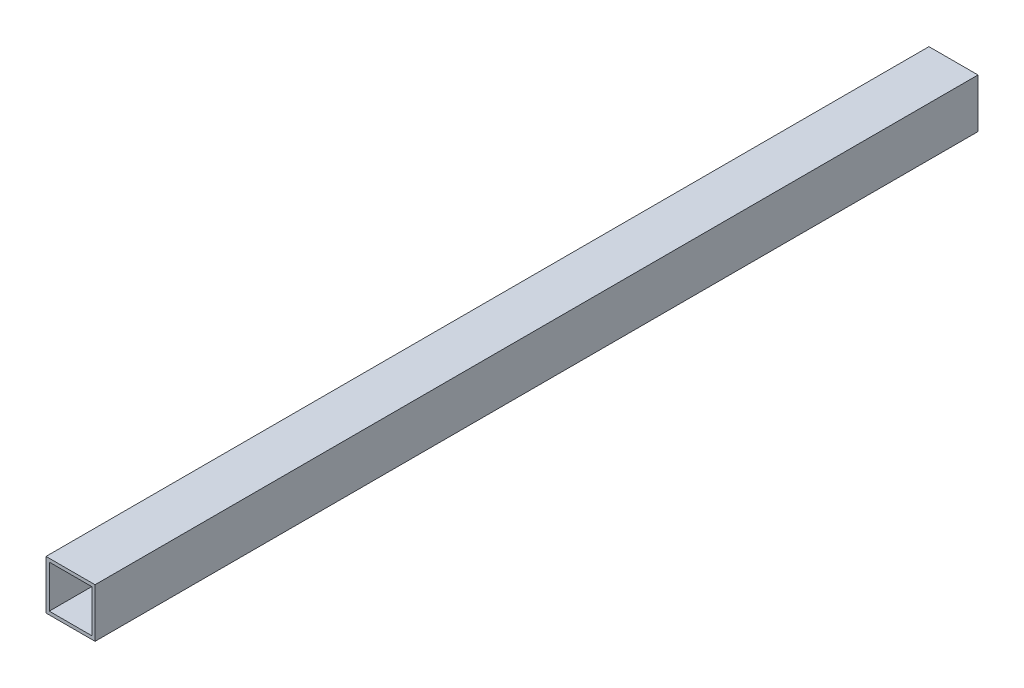
ISO-10303-21;
HEADER;
FILE_DESCRIPTION(('STEP AP214'),'2;1');
FILE_NAME('part.step','',(''),(''),'','','');
FILE_SCHEMA(('AUTOMOTIVE_DESIGN { 1 0 10303 214 1 1 1 1 }'));
ENDSEC;
DATA;
#1=APPLICATION_CONTEXT('core data for automotive mechanical design processes');
#2=APPLICATION_PROTOCOL_DEFINITION('international standard','automotive_design',2000,#1);
#3=PRODUCT_CONTEXT('',#1,'mechanical');
#4=PRODUCT('Part','Part','',(#3));
#5=PRODUCT_RELATED_PRODUCT_CATEGORY('part','',(#4));
#6=PRODUCT_DEFINITION_FORMATION('','',#4);
#7=PRODUCT_DEFINITION_CONTEXT('part definition',#1,'design');
#8=PRODUCT_DEFINITION('design','',#6,#7);
#9=PRODUCT_DEFINITION_SHAPE('','',#8);
#10=(LENGTH_UNIT() NAMED_UNIT(*) SI_UNIT(.MILLI.,.METRE.));
#11=(NAMED_UNIT(*) PLANE_ANGLE_UNIT() SI_UNIT($,.RADIAN.));
#12=(NAMED_UNIT(*) SI_UNIT($,.STERADIAN.) SOLID_ANGLE_UNIT());
#13=UNCERTAINTY_MEASURE_WITH_UNIT(LENGTH_MEASURE(1.E-05),#10,'distance_accuracy_value','');
#14=(GEOMETRIC_REPRESENTATION_CONTEXT(3) GLOBAL_UNCERTAINTY_ASSIGNED_CONTEXT((#13)) GLOBAL_UNIT_ASSIGNED_CONTEXT((#10,
#11,#12)) REPRESENTATION_CONTEXT('',''));
#15=CARTESIAN_POINT('',(0.,0.,0.));
#16=DIRECTION('',(0.,0.,1.));
#17=DIRECTION('',(1.,0.,0.));
#18=AXIS2_PLACEMENT_3D('',#15,#16,#17);
#19=CARTESIAN_POINT('',(0.,0.,270.));
#20=DIRECTION('',(0.,0.,1.));
#21=DIRECTION('',(1.,0.,0.));
#22=AXIS2_PLACEMENT_3D('',#19,#20,#21);
#23=PLANE('',#22);
#24=DIRECTION('',(0.,-1.,0.));
#25=VECTOR('',#24,1.);
#26=CARTESIAN_POINT('',(-7.5,7.5,270.));
#27=LINE('',#26,#25);
#28=CARTESIAN_POINT('',(-7.5,7.5,270.));
#29=VERTEX_POINT('',#28);
#30=CARTESIAN_POINT('',(-7.5,-7.5,270.));
#31=VERTEX_POINT('',#30);
#32=EDGE_CURVE('E134',#29,#31,#27,.T.);
#33=ORIENTED_EDGE('',*,*,#32,.T.);
#34=DIRECTION('',(1.,0.,0.));
#35=VECTOR('',#34,1.);
#36=CARTESIAN_POINT('',(-7.5,-7.5,270.));
#37=LINE('',#36,#35);
#38=CARTESIAN_POINT('',(7.5,-7.5,270.));
#39=VERTEX_POINT('',#38);
#40=EDGE_CURVE('E137',#31,#39,#37,.T.);
#41=ORIENTED_EDGE('',*,*,#40,.T.);
#42=DIRECTION('',(0.,1.,0.));
#43=VECTOR('',#42,1.);
#44=CARTESIAN_POINT('',(7.5,7.5,270.));
#45=LINE('',#44,#43);
#46=CARTESIAN_POINT('',(7.5,7.5,270.));
#47=VERTEX_POINT('',#46);
#48=EDGE_CURVE('E140',#39,#47,#45,.T.);
#49=ORIENTED_EDGE('',*,*,#48,.T.);
#50=DIRECTION('',(-1.,0.,0.));
#51=VECTOR('',#50,1.);
#52=CARTESIAN_POINT('',(-7.5,7.5,270.));
#53=LINE('',#52,#51);
#54=EDGE_CURVE('E142',#47,#29,#53,.T.);
#55=ORIENTED_EDGE('',*,*,#54,.T.);
#56=EDGE_LOOP('',(#33,#41,#49,#55));
#57=FACE_BOUND('',#56,.T.);
#58=DIRECTION('',(-1.,0.,0.));
#59=VECTOR('',#58,1.);
#60=CARTESIAN_POINT('',(-6.5,6.5,270.));
#61=LINE('',#60,#59);
#62=CARTESIAN_POINT('',(6.5,6.5,270.));
#63=VERTEX_POINT('',#62);
#64=CARTESIAN_POINT('',(-6.5,6.5,270.));
#65=VERTEX_POINT('',#64);
#66=EDGE_CURVE('E106',#63,#65,#61,.T.);
#67=ORIENTED_EDGE('',*,*,#66,.F.);
#68=DIRECTION('',(0.,1.,0.));
#69=VECTOR('',#68,1.);
#70=CARTESIAN_POINT('',(6.5,6.5,270.));
#71=LINE('',#70,#69);
#72=CARTESIAN_POINT('',(6.5,-6.5,270.));
#73=VERTEX_POINT('',#72);
#74=EDGE_CURVE('E98',#73,#63,#71,.T.);
#75=ORIENTED_EDGE('',*,*,#74,.F.);
#76=DIRECTION('',(1.,0.,0.));
#77=VECTOR('',#76,1.);
#78=CARTESIAN_POINT('',(-6.5,-6.5,270.));
#79=LINE('',#78,#77);
#80=CARTESIAN_POINT('',(-6.5,-6.5,270.));
#81=VERTEX_POINT('',#80);
#82=EDGE_CURVE('E120',#81,#73,#79,.T.);
#83=ORIENTED_EDGE('',*,*,#82,.F.);
#84=DIRECTION('',(0.,-1.,0.));
#85=VECTOR('',#84,1.);
#86=CARTESIAN_POINT('',(-6.5,6.5,270.));
#87=LINE('',#86,#85);
#88=EDGE_CURVE('E118',#65,#81,#87,.T.);
#89=ORIENTED_EDGE('',*,*,#88,.F.);
#90=EDGE_LOOP('',(#67,#75,#83,#89));
#91=FACE_BOUND('',#90,.T.);
#92=ADVANCED_FACE('F33',(#57,#91),#23,.T.);
#93=CARTESIAN_POINT('',(0.,0.,0.));
#94=DIRECTION('',(0.,0.,1.));
#95=DIRECTION('',(1.,0.,0.));
#96=AXIS2_PLACEMENT_3D('',#93,#94,#95);
#97=PLANE('',#96);
#98=DIRECTION('',(0.,-1.,0.));
#99=VECTOR('',#98,1.);
#100=CARTESIAN_POINT('',(-7.5,7.5,0.));
#101=LINE('',#100,#99);
#102=CARTESIAN_POINT('',(-7.5,7.5,0.));
#103=VERTEX_POINT('',#102);
#104=CARTESIAN_POINT('',(-7.5,-7.5,0.));
#105=VERTEX_POINT('',#104);
#106=EDGE_CURVE('E114',#103,#105,#101,.T.);
#107=ORIENTED_EDGE('',*,*,#106,.F.);
#108=DIRECTION('',(-1.,0.,0.));
#109=VECTOR('',#108,1.);
#110=CARTESIAN_POINT('',(-7.5,7.5,0.));
#111=LINE('',#110,#109);
#112=CARTESIAN_POINT('',(7.5,7.5,0.));
#113=VERTEX_POINT('',#112);
#114=EDGE_CURVE('E138',#113,#103,#111,.T.);
#115=ORIENTED_EDGE('',*,*,#114,.F.);
#116=DIRECTION('',(0.,1.,0.));
#117=VECTOR('',#116,1.);
#118=CARTESIAN_POINT('',(7.5,7.5,0.));
#119=LINE('',#118,#117);
#120=CARTESIAN_POINT('',(7.5,-7.5,0.));
#121=VERTEX_POINT('',#120);
#122=EDGE_CURVE('E149',#121,#113,#119,.T.);
#123=ORIENTED_EDGE('',*,*,#122,.F.);
#124=DIRECTION('',(1.,0.,0.));
#125=VECTOR('',#124,1.);
#126=CARTESIAN_POINT('',(-7.5,-7.5,0.));
#127=LINE('',#126,#125);
#128=EDGE_CURVE('E147',#105,#121,#127,.T.);
#129=ORIENTED_EDGE('',*,*,#128,.F.);
#130=EDGE_LOOP('',(#107,#115,#123,#129));
#131=FACE_BOUND('',#130,.T.);
#132=DIRECTION('',(0.,1.,0.));
#133=VECTOR('',#132,1.);
#134=CARTESIAN_POINT('',(6.5,6.5,0.));
#135=LINE('',#134,#133);
#136=CARTESIAN_POINT('',(6.5,-6.5,0.));
#137=VERTEX_POINT('',#136);
#138=CARTESIAN_POINT('',(6.5,6.5,0.));
#139=VERTEX_POINT('',#138);
#140=EDGE_CURVE('E56',#137,#139,#135,.T.);
#141=ORIENTED_EDGE('',*,*,#140,.T.);
#142=DIRECTION('',(-1.,0.,0.));
#143=VECTOR('',#142,1.);
#144=CARTESIAN_POINT('',(-6.5,6.5,0.));
#145=LINE('',#144,#143);
#146=CARTESIAN_POINT('',(-6.5,6.5,0.));
#147=VERTEX_POINT('',#146);
#148=EDGE_CURVE('E113',#139,#147,#145,.T.);
#149=ORIENTED_EDGE('',*,*,#148,.T.);
#150=DIRECTION('',(0.,-1.,0.));
#151=VECTOR('',#150,1.);
#152=CARTESIAN_POINT('',(-6.5,6.5,0.));
#153=LINE('',#152,#151);
#154=CARTESIAN_POINT('',(-6.5,-6.5,0.));
#155=VERTEX_POINT('',#154);
#156=EDGE_CURVE('E126',#147,#155,#153,.T.);
#157=ORIENTED_EDGE('',*,*,#156,.T.);
#158=DIRECTION('',(1.,0.,0.));
#159=VECTOR('',#158,1.);
#160=CARTESIAN_POINT('',(-6.5,-6.5,0.));
#161=LINE('',#160,#159);
#162=EDGE_CURVE('E107',#155,#137,#161,.T.);
#163=ORIENTED_EDGE('',*,*,#162,.T.);
#164=EDGE_LOOP('',(#141,#149,#157,#163));
#165=FACE_BOUND('',#164,.T.);
#166=ADVANCED_FACE('F167',(#131,#165),#97,.F.);
#167=CARTESIAN_POINT('',(-7.5,7.5,270.));
#168=DIRECTION('',(1.,0.,0.));
#169=DIRECTION('',(0.,1.,0.));
#170=AXIS2_PLACEMENT_3D('',#167,#168,#169);
#171=PLANE('',#170);
#172=ORIENTED_EDGE('',*,*,#106,.T.);
#173=DIRECTION('',(0.,0.,-1.));
#174=VECTOR('',#173,1.);
#175=CARTESIAN_POINT('',(-7.5,-7.5,270.));
#176=LINE('',#175,#174);
#177=EDGE_CURVE('E11',#31,#105,#176,.T.);
#178=ORIENTED_EDGE('',*,*,#177,.F.);
#179=ORIENTED_EDGE('',*,*,#32,.F.);
#180=DIRECTION('',(0.,0.,-1.));
#181=VECTOR('',#180,1.);
#182=CARTESIAN_POINT('',(-7.5,7.5,270.));
#183=LINE('',#182,#181);
#184=EDGE_CURVE('E144',#29,#103,#183,.T.);
#185=ORIENTED_EDGE('',*,*,#184,.T.);
#186=EDGE_LOOP('',(#172,#178,#179,#185));
#187=FACE_BOUND('',#186,.T.);
#188=ADVANCED_FACE('F35',(#187),#171,.F.);
#189=CARTESIAN_POINT('',(-7.5,-7.5,270.));
#190=DIRECTION('',(0.,1.,0.));
#191=DIRECTION('',(0.,0.,1.));
#192=AXIS2_PLACEMENT_3D('',#189,#190,#191);
#193=PLANE('',#192);
#194=ORIENTED_EDGE('',*,*,#128,.T.);
#195=DIRECTION('',(0.,0.,-1.));
#196=VECTOR('',#195,1.);
#197=CARTESIAN_POINT('',(7.5,-7.5,270.));
#198=LINE('',#197,#196);
#199=EDGE_CURVE('E41',#39,#121,#198,.T.);
#200=ORIENTED_EDGE('',*,*,#199,.F.);
#201=ORIENTED_EDGE('',*,*,#40,.F.);
#202=ORIENTED_EDGE('',*,*,#177,.T.);
#203=EDGE_LOOP('',(#194,#200,#201,#202));
#204=FACE_BOUND('',#203,.T.);
#205=ADVANCED_FACE('F177',(#204),#193,.F.);
#206=CARTESIAN_POINT('',(7.5,7.5,270.));
#207=DIRECTION('',(-1.,0.,0.));
#208=DIRECTION('',(0.,-1.,0.));
#209=AXIS2_PLACEMENT_3D('',#206,#207,#208);
#210=PLANE('',#209);
#211=ORIENTED_EDGE('',*,*,#122,.T.);
#212=DIRECTION('',(0.,0.,-1.));
#213=VECTOR('',#212,1.);
#214=CARTESIAN_POINT('',(7.5,7.5,270.));
#215=LINE('',#214,#213);
#216=EDGE_CURVE('E154',#47,#113,#215,.T.);
#217=ORIENTED_EDGE('',*,*,#216,.F.);
#218=ORIENTED_EDGE('',*,*,#48,.F.);
#219=ORIENTED_EDGE('',*,*,#199,.T.);
#220=EDGE_LOOP('',(#211,#217,#218,#219));
#221=FACE_BOUND('',#220,.T.);
#222=ADVANCED_FACE('F161',(#221),#210,.F.);
#223=CARTESIAN_POINT('',(-7.5,7.5,270.));
#224=DIRECTION('',(0.,-1.,0.));
#225=DIRECTION('',(0.,0.,-1.));
#226=AXIS2_PLACEMENT_3D('',#223,#224,#225);
#227=PLANE('',#226);
#228=ORIENTED_EDGE('',*,*,#114,.T.);
#229=ORIENTED_EDGE('',*,*,#184,.F.);
#230=ORIENTED_EDGE('',*,*,#54,.F.);
#231=ORIENTED_EDGE('',*,*,#216,.T.);
#232=EDGE_LOOP('',(#228,#229,#230,#231));
#233=FACE_BOUND('',#232,.T.);
#234=ADVANCED_FACE('F171',(#233),#227,.F.);
#235=CARTESIAN_POINT('',(6.5,6.5,270.));
#236=DIRECTION('',(-1.,0.,0.));
#237=DIRECTION('',(0.,-1.,0.));
#238=AXIS2_PLACEMENT_3D('',#235,#236,#237);
#239=PLANE('',#238);
#240=ORIENTED_EDGE('',*,*,#140,.F.);
#241=DIRECTION('',(0.,0.,-1.));
#242=VECTOR('',#241,1.);
#243=CARTESIAN_POINT('',(6.5,-6.5,270.));
#244=LINE('',#243,#242);
#245=EDGE_CURVE('E102',#73,#137,#244,.T.);
#246=ORIENTED_EDGE('',*,*,#245,.F.);
#247=ORIENTED_EDGE('',*,*,#74,.T.);
#248=DIRECTION('',(0.,0.,-1.));
#249=VECTOR('',#248,1.);
#250=CARTESIAN_POINT('',(6.5,6.5,270.));
#251=LINE('',#250,#249);
#252=EDGE_CURVE('E101',#63,#139,#251,.T.);
#253=ORIENTED_EDGE('',*,*,#252,.T.);
#254=EDGE_LOOP('',(#240,#246,#247,#253));
#255=FACE_BOUND('',#254,.T.);
#256=ADVANCED_FACE('F100',(#255),#239,.T.);
#257=CARTESIAN_POINT('',(-6.5,6.5,270.));
#258=DIRECTION('',(0.,-1.,0.));
#259=DIRECTION('',(0.,0.,-1.));
#260=AXIS2_PLACEMENT_3D('',#257,#258,#259);
#261=PLANE('',#260);
#262=ORIENTED_EDGE('',*,*,#148,.F.);
#263=ORIENTED_EDGE('',*,*,#252,.F.);
#264=ORIENTED_EDGE('',*,*,#66,.T.);
#265=DIRECTION('',(0.,0.,-1.));
#266=VECTOR('',#265,1.);
#267=CARTESIAN_POINT('',(-6.5,6.5,270.));
#268=LINE('',#267,#266);
#269=EDGE_CURVE('E115',#65,#147,#268,.T.);
#270=ORIENTED_EDGE('',*,*,#269,.T.);
#271=EDGE_LOOP('',(#262,#263,#264,#270));
#272=FACE_BOUND('',#271,.T.);
#273=ADVANCED_FACE('F110',(#272),#261,.T.);
#274=CARTESIAN_POINT('',(-6.5,6.5,270.));
#275=DIRECTION('',(1.,0.,0.));
#276=DIRECTION('',(0.,1.,0.));
#277=AXIS2_PLACEMENT_3D('',#274,#275,#276);
#278=PLANE('',#277);
#279=ORIENTED_EDGE('',*,*,#156,.F.);
#280=ORIENTED_EDGE('',*,*,#269,.F.);
#281=ORIENTED_EDGE('',*,*,#88,.T.);
#282=DIRECTION('',(0.,0.,-1.));
#283=VECTOR('',#282,1.);
#284=CARTESIAN_POINT('',(-6.5,-6.5,270.));
#285=LINE('',#284,#283);
#286=EDGE_CURVE('E48',#81,#155,#285,.T.);
#287=ORIENTED_EDGE('',*,*,#286,.T.);
#288=EDGE_LOOP('',(#279,#280,#281,#287));
#289=FACE_BOUND('',#288,.T.);
#290=ADVANCED_FACE('F200',(#289),#278,.T.);
#291=CARTESIAN_POINT('',(-6.5,-6.5,270.));
#292=DIRECTION('',(0.,1.,0.));
#293=DIRECTION('',(0.,0.,1.));
#294=AXIS2_PLACEMENT_3D('',#291,#292,#293);
#295=PLANE('',#294);
#296=ORIENTED_EDGE('',*,*,#162,.F.);
#297=ORIENTED_EDGE('',*,*,#286,.F.);
#298=ORIENTED_EDGE('',*,*,#82,.T.);
#299=ORIENTED_EDGE('',*,*,#245,.T.);
#300=EDGE_LOOP('',(#296,#297,#298,#299));
#301=FACE_BOUND('',#300,.T.);
#302=ADVANCED_FACE('F204',(#301),#295,.T.);
#303=CLOSED_SHELL('',(#92,#166,#188,#205,#222,#234,#256,#273,#290,#302));
#304=MANIFOLD_SOLID_BREP('B2',#303);
#305=ADVANCED_BREP_SHAPE_REPRESENTATION('',(#18,#304),#14);
#306=SHAPE_DEFINITION_REPRESENTATION(#9,#305);
ENDSEC;
END-ISO-10303-21;
